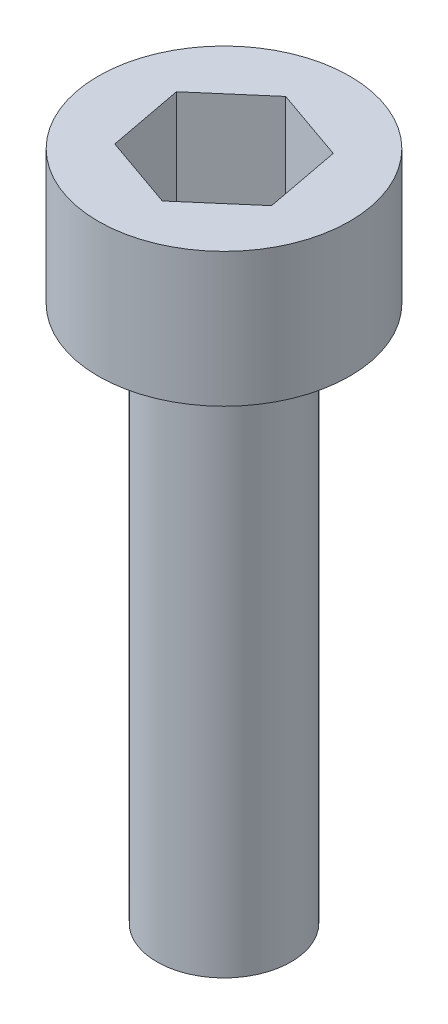
ISO-10303-21;
HEADER;
FILE_DESCRIPTION(('STEP AP214'),'2;1');
FILE_NAME('part.step','',(''),(''),'','','');
FILE_SCHEMA(('AUTOMOTIVE_DESIGN { 1 0 10303 214 1 1 1 1 }'));
ENDSEC;
DATA;
#1=APPLICATION_CONTEXT('core data for automotive mechanical design processes');
#2=APPLICATION_PROTOCOL_DEFINITION('international standard','automotive_design',2000,#1);
#3=PRODUCT_CONTEXT('',#1,'mechanical');
#4=PRODUCT('Part','Part','',(#3));
#5=PRODUCT_RELATED_PRODUCT_CATEGORY('part','',(#4));
#6=PRODUCT_DEFINITION_FORMATION('','',#4);
#7=PRODUCT_DEFINITION_CONTEXT('part definition',#1,'design');
#8=PRODUCT_DEFINITION('design','',#6,#7);
#9=PRODUCT_DEFINITION_SHAPE('','',#8);
#10=(LENGTH_UNIT() NAMED_UNIT(*) SI_UNIT(.MILLI.,.METRE.));
#11=(NAMED_UNIT(*) PLANE_ANGLE_UNIT() SI_UNIT($,.RADIAN.));
#12=(NAMED_UNIT(*) SI_UNIT($,.STERADIAN.) SOLID_ANGLE_UNIT());
#13=UNCERTAINTY_MEASURE_WITH_UNIT(LENGTH_MEASURE(1.E-05),#10,'distance_accuracy_value','');
#14=(GEOMETRIC_REPRESENTATION_CONTEXT(3) GLOBAL_UNCERTAINTY_ASSIGNED_CONTEXT((#13)) GLOBAL_UNIT_ASSIGNED_CONTEXT((#10,
#11,#12)) REPRESENTATION_CONTEXT('',''));
#15=CARTESIAN_POINT('',(0.,0.,0.));
#16=DIRECTION('',(0.,0.,1.));
#17=DIRECTION('',(1.,0.,0.));
#18=AXIS2_PLACEMENT_3D('',#15,#16,#17);
#19=CARTESIAN_POINT('',(0.,0.,0.));
#20=DIRECTION('',(0.,-1.,0.));
#21=DIRECTION('',(1.,0.,0.));
#22=AXIS2_PLACEMENT_3D('',#19,#20,#21);
#23=PLANE('',#22);
#24=CARTESIAN_POINT('',(0.,0.,0.));
#25=DIRECTION('',(0.,1.,0.));
#26=DIRECTION('',(-1.,0.,0.));
#27=AXIS2_PLACEMENT_3D('',#24,#25,#26);
#28=CIRCLE('',#27,1.);
#29=CARTESIAN_POINT('',(-1.,0.,0.));
#30=VERTEX_POINT('',#29);
#31=EDGE_CURVE('E48',#30,#30,#28,.T.);
#32=ORIENTED_EDGE('',*,*,#31,.F.);
#33=EDGE_LOOP('',(#32));
#34=FACE_BOUND('',#33,.T.);
#35=ADVANCED_FACE('F41',(#34),#23,.T.);
#36=CARTESIAN_POINT('',(0.,8.32222536057694,0.));
#37=DIRECTION('',(0.,1.,0.));
#38=DIRECTION('',(-1.,0.,0.));
#39=AXIS2_PLACEMENT_3D('',#36,#37,#38);
#40=CYLINDRICAL_SURFACE('',#39,1.);
#41=ORIENTED_EDGE('',*,*,#31,.T.);
#42=EDGE_LOOP('',(#41));
#43=FACE_BOUND('',#42,.T.);
#44=CARTESIAN_POINT('',(0.,8.,0.));
#45=DIRECTION('',(0.,1.,0.));
#46=DIRECTION('',(-1.,0.,0.));
#47=AXIS2_PLACEMENT_3D('',#44,#45,#46);
#48=CIRCLE('',#47,1.);
#49=CARTESIAN_POINT('',(-1.,8.,0.));
#50=VERTEX_POINT('',#49);
#51=EDGE_CURVE('E11',#50,#50,#48,.T.);
#52=ORIENTED_EDGE('',*,*,#51,.F.);
#53=EDGE_LOOP('',(#52));
#54=FACE_BOUND('',#53,.T.);
#55=ADVANCED_FACE('F54',(#43,#54),#40,.T.);
#56=CARTESIAN_POINT('',(0.,8.,0.));
#57=DIRECTION('',(0.,1.,0.));
#58=DIRECTION('',(0.,0.,1.));
#59=AXIS2_PLACEMENT_3D('',#56,#57,#58);
#60=PLANE('',#59);
#61=ORIENTED_EDGE('',*,*,#51,.T.);
#62=EDGE_LOOP('',(#61));
#63=FACE_BOUND('',#62,.T.);
#64=ADVANCED_FACE('F43',(#63),#60,.T.);
#65=CLOSED_SHELL('',(#35,#55,#64));
#66=MANIFOLD_SOLID_BREP('B2',#65);
#67=CARTESIAN_POINT('',(-1.,8.,0.));
#68=DIRECTION('',(0.,-1.,0.));
#69=DIRECTION('',(1.,0.,0.));
#70=AXIS2_PLACEMENT_3D('',#67,#68,#69);
#71=PLANE('',#70);
#72=DIRECTION('',(-0.186175824705709,0.,-0.982516443778499));
#73=VECTOR('',#72,1.);
#74=CARTESIAN_POINT('',(1.09000510628894,8.,0.381080308593042));
#75=LINE('',#74,#73);
#76=CARTESIAN_POINT('',(1.09000510628894,8.,0.381080308593042));
#77=VERTEX_POINT('',#76);
#78=CARTESIAN_POINT('',(0.875027781268058,8.,-0.753431958004459));
#79=VERTEX_POINT('',#78);
#80=EDGE_CURVE('E130',#77,#79,#75,.T.);
#81=ORIENTED_EDGE('',*,*,#80,.T.);
#82=DIRECTION('',(-0.94397211230098,0.,-0.330025228123587));
#83=VECTOR('',#82,1.);
#84=CARTESIAN_POINT('',(0.875027781268058,8.,-0.753431958004459));
#85=LINE('',#84,#83);
#86=CARTESIAN_POINT('',(-0.214977325020883,8.,-1.1345122665975));
#87=VERTEX_POINT('',#86);
#88=EDGE_CURVE('E222',#79,#87,#85,.T.);
#89=ORIENTED_EDGE('',*,*,#88,.T.);
#90=DIRECTION('',(-0.757796287595271,0.,0.652491215654912));
#91=VECTOR('',#90,1.);
#92=CARTESIAN_POINT('',(-0.214977325020883,8.,-1.1345122665975));
#93=LINE('',#92,#91);
#94=CARTESIAN_POINT('',(-1.09000510628894,8.,-0.381080308593041));
#95=VERTEX_POINT('',#94);
#96=EDGE_CURVE('E144',#87,#95,#93,.T.);
#97=ORIENTED_EDGE('',*,*,#96,.T.);
#98=DIRECTION('',(0.186175824705709,0.,0.982516443778499));
#99=VECTOR('',#98,1.);
#100=CARTESIAN_POINT('',(-1.09000510628894,8.,-0.381080308593041));
#101=LINE('',#100,#99);
#102=CARTESIAN_POINT('',(-0.875027781268057,8.,0.75343195800446));
#103=VERTEX_POINT('',#102);
#104=EDGE_CURVE('E137',#95,#103,#101,.T.);
#105=ORIENTED_EDGE('',*,*,#104,.T.);
#106=DIRECTION('',(0.94397211230098,0.,0.330025228123587));
#107=VECTOR('',#106,1.);
#108=CARTESIAN_POINT('',(-0.875027781268057,8.,0.75343195800446));
#109=LINE('',#108,#107);
#110=CARTESIAN_POINT('',(0.214977325020883,8.,1.1345122665975));
#111=VERTEX_POINT('',#110);
#112=EDGE_CURVE('E141',#103,#111,#109,.T.);
#113=ORIENTED_EDGE('',*,*,#112,.T.);
#114=DIRECTION('',(0.757796287595271,0.,-0.652491215654912));
#115=VECTOR('',#114,1.);
#116=CARTESIAN_POINT('',(0.214977325020883,8.,1.1345122665975));
#117=LINE('',#116,#115);
#118=EDGE_CURVE('E105',#111,#77,#117,.T.);
#119=ORIENTED_EDGE('',*,*,#118,.T.);
#120=EDGE_LOOP('',(#81,#89,#97,#105,#113,#119));
#121=FACE_BOUND('',#120,.T.);
#122=CARTESIAN_POINT('',(0.,8.,0.));
#123=DIRECTION('',(0.,1.,0.));
#124=DIRECTION('',(-1.,0.,0.));
#125=AXIS2_PLACEMENT_3D('',#122,#123,#124);
#126=CIRCLE('',#125,1.875);
#127=CARTESIAN_POINT('',(-1.875,8.,0.));
#128=VERTEX_POINT('',#127);
#129=EDGE_CURVE('E39',#128,#128,#126,.T.);
#130=ORIENTED_EDGE('',*,*,#129,.F.);
#131=EDGE_LOOP('',(#130));
#132=FACE_BOUND('',#131,.T.);
#133=ADVANCED_FACE('F82',(#121,#132),#71,.T.);
#134=CARTESIAN_POINT('',(0.,8.32222536057694,0.));
#135=DIRECTION('',(0.,1.,0.));
#136=DIRECTION('',(-1.,0.,0.));
#137=AXIS2_PLACEMENT_3D('',#134,#135,#136);
#138=CYLINDRICAL_SURFACE('',#137,1.875);
#139=ORIENTED_EDGE('',*,*,#129,.T.);
#140=EDGE_LOOP('',(#139));
#141=FACE_BOUND('',#140,.T.);
#142=CARTESIAN_POINT('',(0.,10.,0.));
#143=DIRECTION('',(0.,1.,0.));
#144=DIRECTION('',(-1.,0.,0.));
#145=AXIS2_PLACEMENT_3D('',#142,#143,#144);
#146=CIRCLE('',#145,1.875);
#147=CARTESIAN_POINT('',(-1.875,10.,0.));
#148=VERTEX_POINT('',#147);
#149=EDGE_CURVE('E89',#148,#148,#146,.T.);
#150=ORIENTED_EDGE('',*,*,#149,.F.);
#151=EDGE_LOOP('',(#150));
#152=FACE_BOUND('',#151,.T.);
#153=ADVANCED_FACE('F187',(#141,#152),#138,.T.);
#154=CARTESIAN_POINT('',(-1.875,10.,0.));
#155=DIRECTION('',(0.,1.,0.));
#156=DIRECTION('',(-1.,0.,0.));
#157=AXIS2_PLACEMENT_3D('',#154,#155,#156);
#158=PLANE('',#157);
#159=DIRECTION('',(-0.186175824705709,0.,-0.982516443778499));
#160=VECTOR('',#159,1.);
#161=CARTESIAN_POINT('',(1.09000510628894,10.,0.381080308593042));
#162=LINE('',#161,#160);
#163=CARTESIAN_POINT('',(1.09000510628894,10.,0.381080308593042));
#164=VERTEX_POINT('',#163);
#165=CARTESIAN_POINT('',(0.875027781268058,10.,-0.753431958004459));
#166=VERTEX_POINT('',#165);
#167=EDGE_CURVE('E96',#164,#166,#162,.T.);
#168=ORIENTED_EDGE('',*,*,#167,.F.);
#169=DIRECTION('',(0.757796287595271,0.,-0.652491215654912));
#170=VECTOR('',#169,1.);
#171=CARTESIAN_POINT('',(0.214977325020883,10.,1.1345122665975));
#172=LINE('',#171,#170);
#173=CARTESIAN_POINT('',(0.214977325020883,10.,1.1345122665975));
#174=VERTEX_POINT('',#173);
#175=EDGE_CURVE('E175',#174,#164,#172,.T.);
#176=ORIENTED_EDGE('',*,*,#175,.F.);
#177=DIRECTION('',(0.94397211230098,0.,0.330025228123587));
#178=VECTOR('',#177,1.);
#179=CARTESIAN_POINT('',(-0.875027781268057,10.,0.75343195800446));
#180=LINE('',#179,#178);
#181=CARTESIAN_POINT('',(-0.875027781268057,10.,0.75343195800446));
#182=VERTEX_POINT('',#181);
#183=EDGE_CURVE('E173',#182,#174,#180,.T.);
#184=ORIENTED_EDGE('',*,*,#183,.F.);
#185=DIRECTION('',(0.186175824705709,0.,0.982516443778499));
#186=VECTOR('',#185,1.);
#187=CARTESIAN_POINT('',(-1.09000510628894,10.,-0.381080308593041));
#188=LINE('',#187,#186);
#189=CARTESIAN_POINT('',(-1.09000510628894,10.,-0.381080308593041));
#190=VERTEX_POINT('',#189);
#191=EDGE_CURVE('E152',#190,#182,#188,.T.);
#192=ORIENTED_EDGE('',*,*,#191,.F.);
#193=DIRECTION('',(-0.757796287595271,0.,0.652491215654912));
#194=VECTOR('',#193,1.);
#195=CARTESIAN_POINT('',(-0.214977325020883,10.,-1.1345122665975));
#196=LINE('',#195,#194);
#197=CARTESIAN_POINT('',(-0.214977325020883,10.,-1.1345122665975));
#198=VERTEX_POINT('',#197);
#199=EDGE_CURVE('E169',#198,#190,#196,.T.);
#200=ORIENTED_EDGE('',*,*,#199,.F.);
#201=DIRECTION('',(-0.94397211230098,0.,-0.330025228123587));
#202=VECTOR('',#201,1.);
#203=CARTESIAN_POINT('',(0.875027781268058,10.,-0.753431958004459));
#204=LINE('',#203,#202);
#205=EDGE_CURVE('E166',#166,#198,#204,.T.);
#206=ORIENTED_EDGE('',*,*,#205,.F.);
#207=EDGE_LOOP('',(#168,#176,#184,#192,#200,#206));
#208=FACE_BOUND('',#207,.T.);
#209=ORIENTED_EDGE('',*,*,#149,.T.);
#210=EDGE_LOOP('',(#209));
#211=FACE_BOUND('',#210,.T.);
#212=ADVANCED_FACE('F185',(#208,#211),#158,.T.);
#213=CARTESIAN_POINT('',(0.875027781268058,8.,-0.753431958004459));
#214=DIRECTION('',(0.330025228123587,0.,-0.94397211230098));
#215=DIRECTION('',(-0.94397211230098,0.,-0.330025228123587));
#216=AXIS2_PLACEMENT_3D('',#213,#214,#215);
#217=PLANE('',#216);
#218=ORIENTED_EDGE('',*,*,#205,.T.);
#219=DIRECTION('',(0.,1.,0.));
#220=VECTOR('',#219,1.);
#221=CARTESIAN_POINT('',(-0.214977325020883,8.,-1.1345122665975));
#222=LINE('',#221,#220);
#223=EDGE_CURVE('E180',#87,#198,#222,.T.);
#224=ORIENTED_EDGE('',*,*,#223,.F.);
#225=ORIENTED_EDGE('',*,*,#88,.F.);
#226=DIRECTION('',(0.,1.,0.));
#227=VECTOR('',#226,1.);
#228=CARTESIAN_POINT('',(0.875027781268058,8.,-0.753431958004459));
#229=LINE('',#228,#227);
#230=EDGE_CURVE('E161',#79,#166,#229,.T.);
#231=ORIENTED_EDGE('',*,*,#230,.T.);
#232=EDGE_LOOP('',(#218,#224,#225,#231));
#233=FACE_BOUND('',#232,.T.);
#234=ADVANCED_FACE('F194',(#233),#217,.F.);
#235=CARTESIAN_POINT('',(-0.214977325020883,8.,-1.1345122665975));
#236=DIRECTION('',(-0.652491215654912,0.,-0.757796287595271));
#237=DIRECTION('',(-0.757796287595271,0.,0.652491215654912));
#238=AXIS2_PLACEMENT_3D('',#235,#236,#237);
#239=PLANE('',#238);
#240=ORIENTED_EDGE('',*,*,#199,.T.);
#241=DIRECTION('',(0.,1.,0.));
#242=VECTOR('',#241,1.);
#243=CARTESIAN_POINT('',(-1.09000510628894,8.,-0.381080308593041));
#244=LINE('',#243,#242);
#245=EDGE_CURVE('E157',#95,#190,#244,.T.);
#246=ORIENTED_EDGE('',*,*,#245,.F.);
#247=ORIENTED_EDGE('',*,*,#96,.F.);
#248=ORIENTED_EDGE('',*,*,#223,.T.);
#249=EDGE_LOOP('',(#240,#246,#247,#248));
#250=FACE_BOUND('',#249,.T.);
#251=ADVANCED_FACE('F204',(#250),#239,.F.);
#252=CARTESIAN_POINT('',(-1.09000510628894,8.,-0.381080308593041));
#253=DIRECTION('',(-0.982516443778499,0.,0.186175824705709));
#254=DIRECTION('',(0.186175824705709,0.,0.982516443778499));
#255=AXIS2_PLACEMENT_3D('',#252,#253,#254);
#256=PLANE('',#255);
#257=ORIENTED_EDGE('',*,*,#191,.T.);
#258=DIRECTION('',(0.,1.,0.));
#259=VECTOR('',#258,1.);
#260=CARTESIAN_POINT('',(-0.875027781268057,8.,0.75343195800446));
#261=LINE('',#260,#259);
#262=EDGE_CURVE('E149',#103,#182,#261,.T.);
#263=ORIENTED_EDGE('',*,*,#262,.F.);
#264=ORIENTED_EDGE('',*,*,#104,.F.);
#265=ORIENTED_EDGE('',*,*,#245,.T.);
#266=EDGE_LOOP('',(#257,#263,#264,#265));
#267=FACE_BOUND('',#266,.T.);
#268=ADVANCED_FACE('F150',(#267),#256,.F.);
#269=CARTESIAN_POINT('',(-0.875027781268057,8.,0.75343195800446));
#270=DIRECTION('',(-0.330025228123587,0.,0.94397211230098));
#271=DIRECTION('',(0.94397211230098,0.,0.330025228123587));
#272=AXIS2_PLACEMENT_3D('',#269,#270,#271);
#273=PLANE('',#272);
#274=ORIENTED_EDGE('',*,*,#183,.T.);
#275=DIRECTION('',(0.,1.,0.));
#276=VECTOR('',#275,1.);
#277=CARTESIAN_POINT('',(0.214977325020883,8.,1.1345122665975));
#278=LINE('',#277,#276);
#279=EDGE_CURVE('E156',#111,#174,#278,.T.);
#280=ORIENTED_EDGE('',*,*,#279,.F.);
#281=ORIENTED_EDGE('',*,*,#112,.F.);
#282=ORIENTED_EDGE('',*,*,#262,.T.);
#283=EDGE_LOOP('',(#274,#280,#281,#282));
#284=FACE_BOUND('',#283,.T.);
#285=ADVANCED_FACE('F159',(#284),#273,.F.);
#286=CARTESIAN_POINT('',(0.214977325020883,8.,1.1345122665975));
#287=DIRECTION('',(0.652491215654912,0.,0.757796287595271));
#288=DIRECTION('',(0.757796287595271,0.,-0.652491215654912));
#289=AXIS2_PLACEMENT_3D('',#286,#287,#288);
#290=PLANE('',#289);
#291=ORIENTED_EDGE('',*,*,#175,.T.);
#292=DIRECTION('',(0.,1.,0.));
#293=VECTOR('',#292,1.);
#294=CARTESIAN_POINT('',(1.09000510628894,8.,0.381080308593042));
#295=LINE('',#294,#293);
#296=EDGE_CURVE('E125',#77,#164,#295,.T.);
#297=ORIENTED_EDGE('',*,*,#296,.F.);
#298=ORIENTED_EDGE('',*,*,#118,.F.);
#299=ORIENTED_EDGE('',*,*,#279,.T.);
#300=EDGE_LOOP('',(#291,#297,#298,#299));
#301=FACE_BOUND('',#300,.T.);
#302=ADVANCED_FACE('F201',(#301),#290,.F.);
#303=CARTESIAN_POINT('',(1.09000510628894,8.,0.381080308593042));
#304=DIRECTION('',(0.982516443778499,0.,-0.186175824705709));
#305=DIRECTION('',(-0.186175824705709,0.,-0.9825164437785));
#306=AXIS2_PLACEMENT_3D('',#303,#304,#305);
#307=PLANE('',#306);
#308=ORIENTED_EDGE('',*,*,#167,.T.);
#309=ORIENTED_EDGE('',*,*,#230,.F.);
#310=ORIENTED_EDGE('',*,*,#80,.F.);
#311=ORIENTED_EDGE('',*,*,#296,.T.);
#312=EDGE_LOOP('',(#308,#309,#310,#311));
#313=FACE_BOUND('',#312,.T.);
#314=ADVANCED_FACE('F198',(#313),#307,.F.);
#315=CLOSED_SHELL('',(#133,#153,#212,#234,#251,#268,#285,#302,#314));
#316=MANIFOLD_SOLID_BREP('B6',#315);
#317=ADVANCED_BREP_SHAPE_REPRESENTATION('',(#18,#66,#316),#14);
#318=SHAPE_DEFINITION_REPRESENTATION(#9,#317);
ENDSEC;
END-ISO-10303-21;
